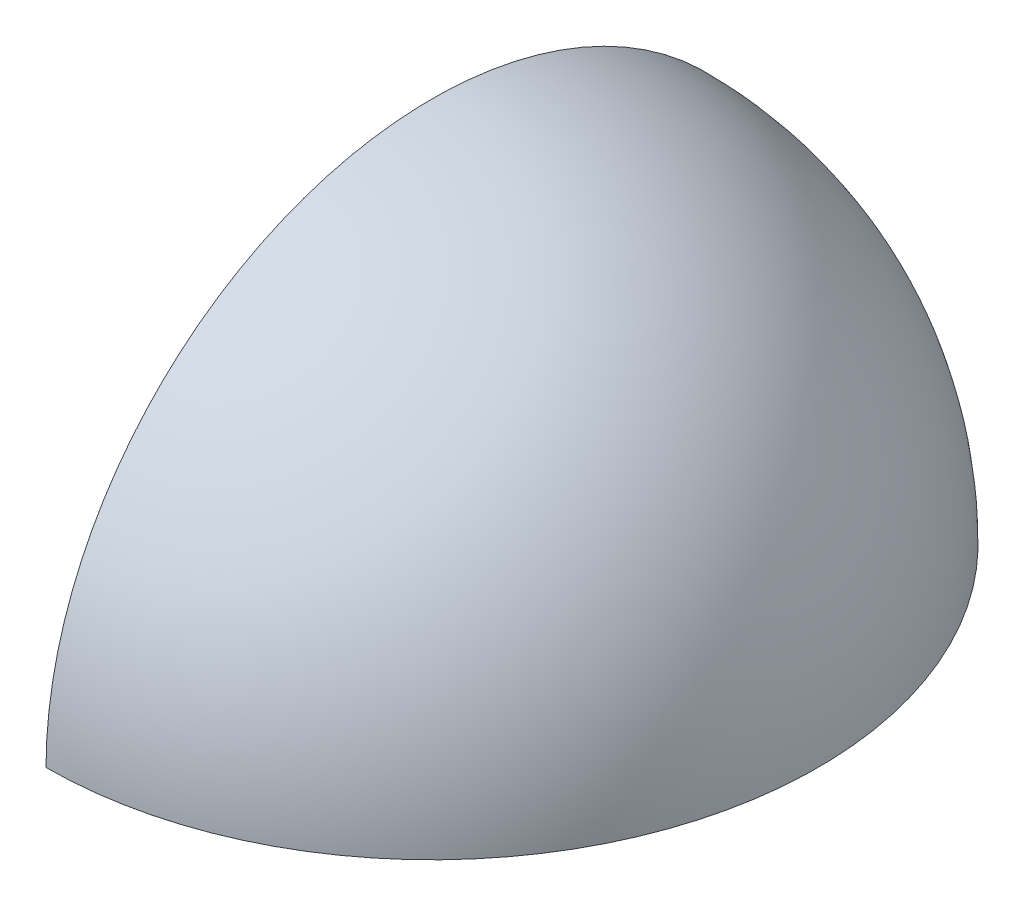
ISO-10303-21;
HEADER;
FILE_DESCRIPTION(('STEP AP214'),'2;1');
FILE_NAME('part.step','',(''),(''),'','','');
FILE_SCHEMA(('AUTOMOTIVE_DESIGN { 1 0 10303 214 1 1 1 1 }'));
ENDSEC;
DATA;
#1=APPLICATION_CONTEXT('core data for automotive mechanical design processes');
#2=APPLICATION_PROTOCOL_DEFINITION('international standard','automotive_design',2000,#1);
#3=PRODUCT_CONTEXT('',#1,'mechanical');
#4=PRODUCT('Part','Part','',(#3));
#5=PRODUCT_RELATED_PRODUCT_CATEGORY('part','',(#4));
#6=PRODUCT_DEFINITION_FORMATION('','',#4);
#7=PRODUCT_DEFINITION_CONTEXT('part definition',#1,'design');
#8=PRODUCT_DEFINITION('design','',#6,#7);
#9=PRODUCT_DEFINITION_SHAPE('','',#8);
#10=(LENGTH_UNIT() NAMED_UNIT(*) SI_UNIT(.MILLI.,.METRE.));
#11=(NAMED_UNIT(*) PLANE_ANGLE_UNIT() SI_UNIT($,.RADIAN.));
#12=(NAMED_UNIT(*) SI_UNIT($,.STERADIAN.) SOLID_ANGLE_UNIT());
#13=UNCERTAINTY_MEASURE_WITH_UNIT(LENGTH_MEASURE(1.E-05),#10,'distance_accuracy_value','');
#14=(GEOMETRIC_REPRESENTATION_CONTEXT(3) GLOBAL_UNCERTAINTY_ASSIGNED_CONTEXT((#13)) GLOBAL_UNIT_ASSIGNED_CONTEXT((#10,
#11,#12)) REPRESENTATION_CONTEXT('',''));
#15=CARTESIAN_POINT('',(0.,0.,0.));
#16=DIRECTION('',(0.,0.,1.));
#17=DIRECTION('',(1.,0.,0.));
#18=AXIS2_PLACEMENT_3D('',#15,#16,#17);
#19=CARTESIAN_POINT('',(0.,0.,0.));
#20=DIRECTION('',(0.,0.,-1.));
#21=DIRECTION('',(0.,1.,0.));
#22=AXIS2_PLACEMENT_3D('',#19,#20,#21);
#23=SPHERICAL_SURFACE('',#22,19.05);
#24=CARTESIAN_POINT('',(0.,0.,0.));
#25=DIRECTION('',(0.,1.,0.));
#26=DIRECTION('',(0.,0.,-1.));
#27=AXIS2_PLACEMENT_3D('',#24,#25,#26);
#28=CIRCLE('',#27,19.05);
#29=CARTESIAN_POINT('',(0.,0.,19.05));
#30=VERTEX_POINT('',#29);
#31=CARTESIAN_POINT('',(0.,0.,-19.05));
#32=VERTEX_POINT('',#31);
#33=EDGE_CURVE('E48',#30,#32,#28,.T.);
#34=ORIENTED_EDGE('',*,*,#33,.T.);
#35=CARTESIAN_POINT('',(0.,0.,0.));
#36=DIRECTION('',(-1.,0.,0.));
#37=DIRECTION('',(0.,0.,-1.));
#38=AXIS2_PLACEMENT_3D('',#35,#36,#37);
#39=CIRCLE('',#38,19.05);
#40=EDGE_CURVE('E42',#30,#32,#39,.T.);
#41=ORIENTED_EDGE('',*,*,#40,.F.);
#42=EDGE_LOOP('',(#34,#41));
#43=FACE_BOUND('',#42,.T.);
#44=ADVANCED_FACE('F35',(#43),#23,.T.);
#45=CARTESIAN_POINT('',(0.,0.,0.));
#46=DIRECTION('',(1.,0.,0.));
#47=DIRECTION('',(0.,0.,-1.));
#48=AXIS2_PLACEMENT_3D('',#45,#46,#47);
#49=PLANE('',#48);
#50=ORIENTED_EDGE('',*,*,#40,.T.);
#51=DIRECTION('',(0.,0.,1.));
#52=VECTOR('',#51,1.);
#53=CARTESIAN_POINT('',(0.,0.,-19.05));
#54=LINE('',#53,#52);
#55=EDGE_CURVE('E11',#32,#30,#54,.T.);
#56=ORIENTED_EDGE('',*,*,#55,.T.);
#57=EDGE_LOOP('',(#50,#56));
#58=FACE_BOUND('',#57,.T.);
#59=ADVANCED_FACE('F55',(#58),#49,.F.);
#60=CARTESIAN_POINT('',(0.,0.,0.));
#61=DIRECTION('',(0.,-1.,0.));
#62=DIRECTION('',(0.,0.,-1.));
#63=AXIS2_PLACEMENT_3D('',#60,#61,#62);
#64=PLANE('',#63);
#65=ORIENTED_EDGE('',*,*,#33,.F.);
#66=ORIENTED_EDGE('',*,*,#55,.F.);
#67=EDGE_LOOP('',(#65,#66));
#68=FACE_BOUND('',#67,.T.);
#69=ADVANCED_FACE('F53',(#68),#64,.T.);
#70=CLOSED_SHELL('',(#44,#59,#69));
#71=MANIFOLD_SOLID_BREP('B2',#70);
#72=ADVANCED_BREP_SHAPE_REPRESENTATION('',(#18,#71),#14);
#73=SHAPE_DEFINITION_REPRESENTATION(#9,#72);
ENDSEC;
END-ISO-10303-21;
